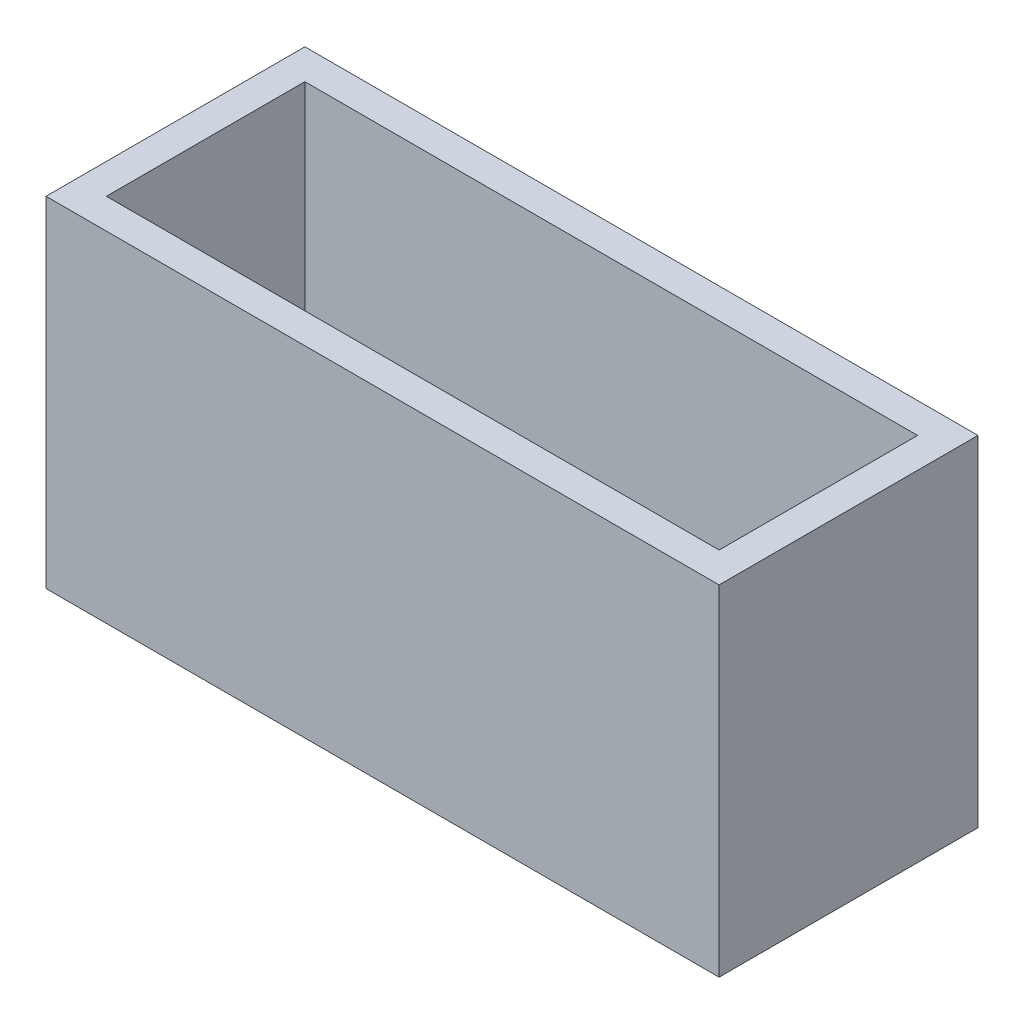
ISO-10303-21;
HEADER;
FILE_DESCRIPTION(('STEP AP214'),'2;1');
FILE_NAME('part.step','',(''),(''),'','','');
FILE_SCHEMA(('AUTOMOTIVE_DESIGN { 1 0 10303 214 1 1 1 1 }'));
ENDSEC;
DATA;
#1=APPLICATION_CONTEXT('core data for automotive mechanical design processes');
#2=APPLICATION_PROTOCOL_DEFINITION('international standard','automotive_design',2000,#1);
#3=PRODUCT_CONTEXT('',#1,'mechanical');
#4=PRODUCT('Part','Part','',(#3));
#5=PRODUCT_RELATED_PRODUCT_CATEGORY('part','',(#4));
#6=PRODUCT_DEFINITION_FORMATION('','',#4);
#7=PRODUCT_DEFINITION_CONTEXT('part definition',#1,'design');
#8=PRODUCT_DEFINITION('design','',#6,#7);
#9=PRODUCT_DEFINITION_SHAPE('','',#8);
#10=(LENGTH_UNIT() NAMED_UNIT(*) SI_UNIT(.MILLI.,.METRE.));
#11=(NAMED_UNIT(*) PLANE_ANGLE_UNIT() SI_UNIT($,.RADIAN.));
#12=(NAMED_UNIT(*) SI_UNIT($,.STERADIAN.) SOLID_ANGLE_UNIT());
#13=UNCERTAINTY_MEASURE_WITH_UNIT(LENGTH_MEASURE(1.E-05),#10,'distance_accuracy_value','');
#14=(GEOMETRIC_REPRESENTATION_CONTEXT(3) GLOBAL_UNCERTAINTY_ASSIGNED_CONTEXT((#13)) GLOBAL_UNIT_ASSIGNED_CONTEXT((#10,
#11,#12)) REPRESENTATION_CONTEXT('',''));
#15=CARTESIAN_POINT('',(0.,0.,0.));
#16=DIRECTION('',(0.,0.,1.));
#17=DIRECTION('',(1.,0.,0.));
#18=AXIS2_PLACEMENT_3D('',#15,#16,#17);
#19=CARTESIAN_POINT('',(0.,1000.,0.));
#20=DIRECTION('',(0.,1.,0.));
#21=DIRECTION('',(0.,0.,1.));
#22=AXIS2_PLACEMENT_3D('',#19,#20,#21);
#23=PLANE('',#22);
#24=DIRECTION('',(0.,0.,-1.));
#25=VECTOR('',#24,1.);
#26=CARTESIAN_POINT('',(990.600000000005,1000.,-380.999999999998));
#27=LINE('',#26,#25);
#28=CARTESIAN_POINT('',(990.600000000005,1000.,381.000000000002));
#29=VERTEX_POINT('',#28);
#30=CARTESIAN_POINT('',(990.600000000005,1000.,-380.999999999998));
#31=VERTEX_POINT('',#30);
#32=EDGE_CURVE('E153',#29,#31,#27,.T.);
#33=ORIENTED_EDGE('',*,*,#32,.T.);
#34=DIRECTION('',(-1.,0.,0.));
#35=VECTOR('',#34,1.);
#36=CARTESIAN_POINT('',(-990.599999999995,1000.,-380.999999999998));
#37=LINE('',#36,#35);
#38=CARTESIAN_POINT('',(-990.599999999995,1000.,-380.999999999998));
#39=VERTEX_POINT('',#38);
#40=EDGE_CURVE('E157',#31,#39,#37,.T.);
#41=ORIENTED_EDGE('',*,*,#40,.T.);
#42=DIRECTION('',(0.,0.,1.));
#43=VECTOR('',#42,1.);
#44=CARTESIAN_POINT('',(-990.599999999995,1000.,-380.999999999998));
#45=LINE('',#44,#43);
#46=CARTESIAN_POINT('',(-990.599999999995,1000.,381.000000000002));
#47=VERTEX_POINT('',#46);
#48=EDGE_CURVE('E161',#39,#47,#45,.T.);
#49=ORIENTED_EDGE('',*,*,#48,.T.);
#50=DIRECTION('',(1.,0.,0.));
#51=VECTOR('',#50,1.);
#52=CARTESIAN_POINT('',(-990.599999999995,1000.,381.000000000002));
#53=LINE('',#52,#51);
#54=EDGE_CURVE('E164',#47,#29,#53,.T.);
#55=ORIENTED_EDGE('',*,*,#54,.T.);
#56=EDGE_LOOP('',(#33,#41,#49,#55));
#57=FACE_BOUND('',#56,.T.);
#58=DIRECTION('',(1.,0.,0.));
#59=VECTOR('',#58,1.);
#60=CARTESIAN_POINT('',(-901.699999999995,1000.,292.100000000002));
#61=LINE('',#60,#59);
#62=CARTESIAN_POINT('',(-901.699999999995,1000.,292.100000000002));
#63=VERTEX_POINT('',#62);
#64=CARTESIAN_POINT('',(901.700000000005,1000.,292.100000000002));
#65=VERTEX_POINT('',#64);
#66=EDGE_CURVE('E114',#63,#65,#61,.T.);
#67=ORIENTED_EDGE('',*,*,#66,.F.);
#68=DIRECTION('',(0.,0.,1.));
#69=VECTOR('',#68,1.);
#70=CARTESIAN_POINT('',(-901.699999999995,1000.,-292.099999999998));
#71=LINE('',#70,#69);
#72=CARTESIAN_POINT('',(-901.699999999995,1000.,-292.099999999998));
#73=VERTEX_POINT('',#72);
#74=EDGE_CURVE('E105',#73,#63,#71,.T.);
#75=ORIENTED_EDGE('',*,*,#74,.F.);
#76=DIRECTION('',(-1.,0.,0.));
#77=VECTOR('',#76,1.);
#78=CARTESIAN_POINT('',(-901.699999999995,1000.,-292.099999999998));
#79=LINE('',#78,#77);
#80=CARTESIAN_POINT('',(901.700000000005,1000.,-292.099999999998));
#81=VERTEX_POINT('',#80);
#82=EDGE_CURVE('E131',#81,#73,#79,.T.);
#83=ORIENTED_EDGE('',*,*,#82,.F.);
#84=DIRECTION('',(0.,0.,-1.));
#85=VECTOR('',#84,1.);
#86=CARTESIAN_POINT('',(901.700000000005,1000.,-292.099999999998));
#87=LINE('',#86,#85);
#88=EDGE_CURVE('E127',#65,#81,#87,.T.);
#89=ORIENTED_EDGE('',*,*,#88,.F.);
#90=EDGE_LOOP('',(#67,#75,#83,#89));
#91=FACE_BOUND('',#90,.T.);
#92=ADVANCED_FACE('F39',(#57,#91),#23,.T.);
#93=CARTESIAN_POINT('',(0.,0.,0.));
#94=DIRECTION('',(0.,1.,0.));
#95=DIRECTION('',(0.,0.,1.));
#96=AXIS2_PLACEMENT_3D('',#93,#94,#95);
#97=PLANE('',#96);
#98=DIRECTION('',(0.,0.,-1.));
#99=VECTOR('',#98,1.);
#100=CARTESIAN_POINT('',(990.600000000005,0.,-380.999999999998));
#101=LINE('',#100,#99);
#102=CARTESIAN_POINT('',(990.600000000005,0.,381.000000000002));
#103=VERTEX_POINT('',#102);
#104=CARTESIAN_POINT('',(990.600000000005,0.,-380.999999999998));
#105=VERTEX_POINT('',#104);
#106=EDGE_CURVE('E123',#103,#105,#101,.T.);
#107=ORIENTED_EDGE('',*,*,#106,.F.);
#108=DIRECTION('',(1.,0.,0.));
#109=VECTOR('',#108,1.);
#110=CARTESIAN_POINT('',(-990.599999999995,0.,381.000000000002));
#111=LINE('',#110,#109);
#112=CARTESIAN_POINT('',(-990.599999999995,0.,381.000000000002));
#113=VERTEX_POINT('',#112);
#114=EDGE_CURVE('E158',#113,#103,#111,.T.);
#115=ORIENTED_EDGE('',*,*,#114,.F.);
#116=DIRECTION('',(0.,0.,1.));
#117=VECTOR('',#116,1.);
#118=CARTESIAN_POINT('',(-990.599999999995,0.,-380.999999999998));
#119=LINE('',#118,#117);
#120=CARTESIAN_POINT('',(-990.599999999995,0.,-380.999999999998));
#121=VERTEX_POINT('',#120);
#122=EDGE_CURVE('E174',#121,#113,#119,.T.);
#123=ORIENTED_EDGE('',*,*,#122,.F.);
#124=DIRECTION('',(-1.,0.,0.));
#125=VECTOR('',#124,1.);
#126=CARTESIAN_POINT('',(-990.599999999995,0.,-380.999999999998));
#127=LINE('',#126,#125);
#128=EDGE_CURVE('E171',#105,#121,#127,.T.);
#129=ORIENTED_EDGE('',*,*,#128,.F.);
#130=EDGE_LOOP('',(#107,#115,#123,#129));
#131=FACE_BOUND('',#130,.T.);
#132=DIRECTION('',(0.,0.,1.));
#133=VECTOR('',#132,1.);
#134=CARTESIAN_POINT('',(-901.699999999995,0.,-292.099999999998));
#135=LINE('',#134,#133);
#136=CARTESIAN_POINT('',(-901.699999999995,0.,-292.099999999998));
#137=VERTEX_POINT('',#136);
#138=CARTESIAN_POINT('',(-901.699999999995,0.,292.100000000002));
#139=VERTEX_POINT('',#138);
#140=EDGE_CURVE('E63',#137,#139,#135,.T.);
#141=ORIENTED_EDGE('',*,*,#140,.T.);
#142=DIRECTION('',(1.,0.,0.));
#143=VECTOR('',#142,1.);
#144=CARTESIAN_POINT('',(-901.699999999995,0.,292.100000000002));
#145=LINE('',#144,#143);
#146=CARTESIAN_POINT('',(901.700000000005,0.,292.100000000002));
#147=VERTEX_POINT('',#146);
#148=EDGE_CURVE('E121',#139,#147,#145,.T.);
#149=ORIENTED_EDGE('',*,*,#148,.T.);
#150=DIRECTION('',(0.,0.,-1.));
#151=VECTOR('',#150,1.);
#152=CARTESIAN_POINT('',(901.700000000005,0.,-292.099999999998));
#153=LINE('',#152,#151);
#154=CARTESIAN_POINT('',(901.700000000005,0.,-292.099999999998));
#155=VERTEX_POINT('',#154);
#156=EDGE_CURVE('E140',#147,#155,#153,.T.);
#157=ORIENTED_EDGE('',*,*,#156,.T.);
#158=DIRECTION('',(-1.,0.,0.));
#159=VECTOR('',#158,1.);
#160=CARTESIAN_POINT('',(-901.699999999995,0.,-292.099999999998));
#161=LINE('',#160,#159);
#162=EDGE_CURVE('E115',#155,#137,#161,.T.);
#163=ORIENTED_EDGE('',*,*,#162,.T.);
#164=EDGE_LOOP('',(#141,#149,#157,#163));
#165=FACE_BOUND('',#164,.T.);
#166=ADVANCED_FACE('F197',(#131,#165),#97,.F.);
#167=CARTESIAN_POINT('',(990.600000000005,1000.,-380.999999999998));
#168=DIRECTION('',(-1.,0.,0.));
#169=DIRECTION('',(0.,0.,1.));
#170=AXIS2_PLACEMENT_3D('',#167,#168,#169);
#171=PLANE('',#170);
#172=ORIENTED_EDGE('',*,*,#106,.T.);
#173=DIRECTION('',(0.,-1.,0.));
#174=VECTOR('',#173,1.);
#175=CARTESIAN_POINT('',(990.600000000005,1000.,-380.999999999998));
#176=LINE('',#175,#174);
#177=EDGE_CURVE('E11',#31,#105,#176,.T.);
#178=ORIENTED_EDGE('',*,*,#177,.F.);
#179=ORIENTED_EDGE('',*,*,#32,.F.);
#180=DIRECTION('',(0.,-1.,0.));
#181=VECTOR('',#180,1.);
#182=CARTESIAN_POINT('',(990.600000000005,1000.,381.000000000002));
#183=LINE('',#182,#181);
#184=EDGE_CURVE('E167',#29,#103,#183,.T.);
#185=ORIENTED_EDGE('',*,*,#184,.T.);
#186=EDGE_LOOP('',(#172,#178,#179,#185));
#187=FACE_BOUND('',#186,.T.);
#188=ADVANCED_FACE('F41',(#187),#171,.F.);
#189=CARTESIAN_POINT('',(-990.599999999995,1000.,-380.999999999998));
#190=DIRECTION('',(0.,0.,1.));
#191=DIRECTION('',(1.,0.,0.));
#192=AXIS2_PLACEMENT_3D('',#189,#190,#191);
#193=PLANE('',#192);
#194=ORIENTED_EDGE('',*,*,#128,.T.);
#195=DIRECTION('',(0.,-1.,0.));
#196=VECTOR('',#195,1.);
#197=CARTESIAN_POINT('',(-990.599999999995,1000.,-380.999999999998));
#198=LINE('',#197,#196);
#199=EDGE_CURVE('E48',#39,#121,#198,.T.);
#200=ORIENTED_EDGE('',*,*,#199,.F.);
#201=ORIENTED_EDGE('',*,*,#40,.F.);
#202=ORIENTED_EDGE('',*,*,#177,.T.);
#203=EDGE_LOOP('',(#194,#200,#201,#202));
#204=FACE_BOUND('',#203,.T.);
#205=ADVANCED_FACE('F207',(#204),#193,.F.);
#206=CARTESIAN_POINT('',(-990.599999999995,1000.,-380.999999999998));
#207=DIRECTION('',(1.,0.,0.));
#208=DIRECTION('',(0.,0.,-1.));
#209=AXIS2_PLACEMENT_3D('',#206,#207,#208);
#210=PLANE('',#209);
#211=ORIENTED_EDGE('',*,*,#122,.T.);
#212=DIRECTION('',(0.,-1.,0.));
#213=VECTOR('',#212,1.);
#214=CARTESIAN_POINT('',(-990.599999999995,1000.,381.000000000002));
#215=LINE('',#214,#213);
#216=EDGE_CURVE('E182',#47,#113,#215,.T.);
#217=ORIENTED_EDGE('',*,*,#216,.F.);
#218=ORIENTED_EDGE('',*,*,#48,.F.);
#219=ORIENTED_EDGE('',*,*,#199,.T.);
#220=EDGE_LOOP('',(#211,#217,#218,#219));
#221=FACE_BOUND('',#220,.T.);
#222=ADVANCED_FACE('F191',(#221),#210,.F.);
#223=CARTESIAN_POINT('',(-990.599999999995,1000.,381.000000000002));
#224=DIRECTION('',(0.,0.,-1.));
#225=DIRECTION('',(-1.,0.,0.));
#226=AXIS2_PLACEMENT_3D('',#223,#224,#225);
#227=PLANE('',#226);
#228=ORIENTED_EDGE('',*,*,#114,.T.);
#229=ORIENTED_EDGE('',*,*,#184,.F.);
#230=ORIENTED_EDGE('',*,*,#54,.F.);
#231=ORIENTED_EDGE('',*,*,#216,.T.);
#232=EDGE_LOOP('',(#228,#229,#230,#231));
#233=FACE_BOUND('',#232,.T.);
#234=ADVANCED_FACE('F201',(#233),#227,.F.);
#235=CARTESIAN_POINT('',(-901.699999999995,1000.,-292.099999999998));
#236=DIRECTION('',(1.,0.,0.));
#237=DIRECTION('',(0.,0.,-1.));
#238=AXIS2_PLACEMENT_3D('',#235,#236,#237);
#239=PLANE('',#238);
#240=ORIENTED_EDGE('',*,*,#140,.F.);
#241=DIRECTION('',(0.,-1.,0.));
#242=VECTOR('',#241,1.);
#243=CARTESIAN_POINT('',(-901.699999999995,1000.,-292.099999999998));
#244=LINE('',#243,#242);
#245=EDGE_CURVE('E109',#73,#137,#244,.T.);
#246=ORIENTED_EDGE('',*,*,#245,.F.);
#247=ORIENTED_EDGE('',*,*,#74,.T.);
#248=DIRECTION('',(0.,-1.,0.));
#249=VECTOR('',#248,1.);
#250=CARTESIAN_POINT('',(-901.699999999995,1000.,292.100000000002));
#251=LINE('',#250,#249);
#252=EDGE_CURVE('E108',#63,#139,#251,.T.);
#253=ORIENTED_EDGE('',*,*,#252,.T.);
#254=EDGE_LOOP('',(#240,#246,#247,#253));
#255=FACE_BOUND('',#254,.T.);
#256=ADVANCED_FACE('F107',(#255),#239,.T.);
#257=CARTESIAN_POINT('',(-901.699999999995,1000.,292.100000000002));
#258=DIRECTION('',(0.,0.,-1.));
#259=DIRECTION('',(-1.,0.,0.));
#260=AXIS2_PLACEMENT_3D('',#257,#258,#259);
#261=PLANE('',#260);
#262=ORIENTED_EDGE('',*,*,#148,.F.);
#263=ORIENTED_EDGE('',*,*,#252,.F.);
#264=ORIENTED_EDGE('',*,*,#66,.T.);
#265=DIRECTION('',(0.,-1.,0.));
#266=VECTOR('',#265,1.);
#267=CARTESIAN_POINT('',(901.700000000005,1000.,292.100000000002));
#268=LINE('',#267,#266);
#269=EDGE_CURVE('E124',#65,#147,#268,.T.);
#270=ORIENTED_EDGE('',*,*,#269,.T.);
#271=EDGE_LOOP('',(#262,#263,#264,#270));
#272=FACE_BOUND('',#271,.T.);
#273=ADVANCED_FACE('F118',(#272),#261,.T.);
#274=CARTESIAN_POINT('',(901.700000000005,1000.,-292.099999999998));
#275=DIRECTION('',(-1.,0.,0.));
#276=DIRECTION('',(0.,0.,1.));
#277=AXIS2_PLACEMENT_3D('',#274,#275,#276);
#278=PLANE('',#277);
#279=ORIENTED_EDGE('',*,*,#156,.F.);
#280=ORIENTED_EDGE('',*,*,#269,.F.);
#281=ORIENTED_EDGE('',*,*,#88,.T.);
#282=DIRECTION('',(0.,-1.,0.));
#283=VECTOR('',#282,1.);
#284=CARTESIAN_POINT('',(901.700000000005,1000.,-292.099999999998));
#285=LINE('',#284,#283);
#286=EDGE_CURVE('E55',#81,#155,#285,.T.);
#287=ORIENTED_EDGE('',*,*,#286,.T.);
#288=EDGE_LOOP('',(#279,#280,#281,#287));
#289=FACE_BOUND('',#288,.T.);
#290=ADVANCED_FACE('F230',(#289),#278,.T.);
#291=CARTESIAN_POINT('',(-901.699999999995,1000.,-292.099999999998));
#292=DIRECTION('',(0.,0.,1.));
#293=DIRECTION('',(1.,0.,0.));
#294=AXIS2_PLACEMENT_3D('',#291,#292,#293);
#295=PLANE('',#294);
#296=ORIENTED_EDGE('',*,*,#162,.F.);
#297=ORIENTED_EDGE('',*,*,#286,.F.);
#298=ORIENTED_EDGE('',*,*,#82,.T.);
#299=ORIENTED_EDGE('',*,*,#245,.T.);
#300=EDGE_LOOP('',(#296,#297,#298,#299));
#301=FACE_BOUND('',#300,.T.);
#302=ADVANCED_FACE('F234',(#301),#295,.T.);
#303=CLOSED_SHELL('',(#92,#166,#188,#205,#222,#234,#256,#273,#290,#302));
#304=MANIFOLD_SOLID_BREP('B2',#303);
#305=ADVANCED_BREP_SHAPE_REPRESENTATION('',(#18,#304),#14);
#306=SHAPE_DEFINITION_REPRESENTATION(#9,#305);
ENDSEC;
END-ISO-10303-21;
